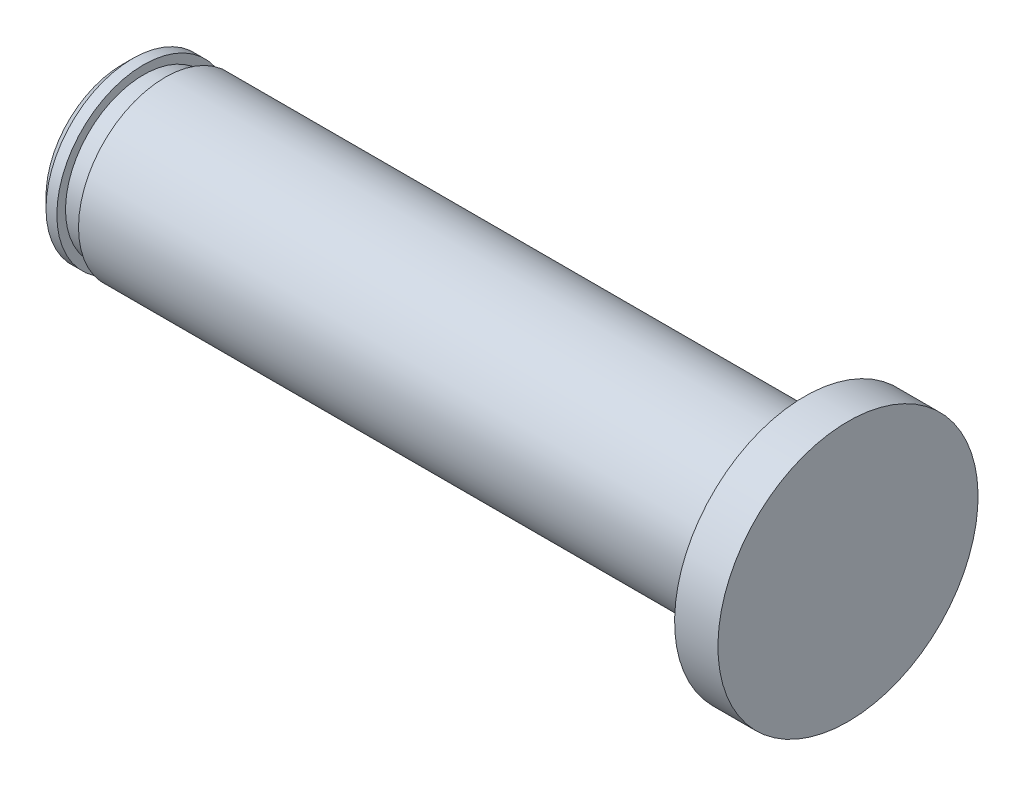
ISO-10303-21;
HEADER;
FILE_DESCRIPTION(('STEP AP214'),'2;1');
FILE_NAME('part.step','',(''),(''),'','','');
FILE_SCHEMA(('AUTOMOTIVE_DESIGN { 1 0 10303 214 1 1 1 1 }'));
ENDSEC;
DATA;
#1=APPLICATION_CONTEXT('core data for automotive mechanical design processes');
#2=APPLICATION_PROTOCOL_DEFINITION('international standard','automotive_design',2000,#1);
#3=PRODUCT_CONTEXT('',#1,'mechanical');
#4=PRODUCT('Part','Part','',(#3));
#5=PRODUCT_RELATED_PRODUCT_CATEGORY('part','',(#4));
#6=PRODUCT_DEFINITION_FORMATION('','',#4);
#7=PRODUCT_DEFINITION_CONTEXT('part definition',#1,'design');
#8=PRODUCT_DEFINITION('design','',#6,#7);
#9=PRODUCT_DEFINITION_SHAPE('','',#8);
#10=(LENGTH_UNIT() NAMED_UNIT(*) SI_UNIT(.MILLI.,.METRE.));
#11=(NAMED_UNIT(*) PLANE_ANGLE_UNIT() SI_UNIT($,.RADIAN.));
#12=(NAMED_UNIT(*) SI_UNIT($,.STERADIAN.) SOLID_ANGLE_UNIT());
#13=UNCERTAINTY_MEASURE_WITH_UNIT(LENGTH_MEASURE(1.E-05),#10,'distance_accuracy_value','');
#14=(GEOMETRIC_REPRESENTATION_CONTEXT(3) GLOBAL_UNCERTAINTY_ASSIGNED_CONTEXT((#13)) GLOBAL_UNIT_ASSIGNED_CONTEXT((#10,
#11,#12)) REPRESENTATION_CONTEXT('',''));
#15=CARTESIAN_POINT('',(0.,0.,0.));
#16=DIRECTION('',(0.,0.,1.));
#17=DIRECTION('',(1.,0.,0.));
#18=AXIS2_PLACEMENT_3D('',#15,#16,#17);
#19=CARTESIAN_POINT('',(0.,6.,0.));
#20=DIRECTION('',(-1.,0.,0.));
#21=DIRECTION('',(0.,-1.,0.));
#22=AXIS2_PLACEMENT_3D('',#19,#20,#21);
#23=PLANE('',#22);
#24=CARTESIAN_POINT('',(0.,0.,0.));
#25=DIRECTION('',(-1.,0.,0.));
#26=DIRECTION('',(0.,-1.,0.));
#27=AXIS2_PLACEMENT_3D('',#24,#25,#26);
#28=CIRCLE('',#27,6.);
#29=CARTESIAN_POINT('',(0.,-6.,0.));
#30=VERTEX_POINT('',#29);
#31=EDGE_CURVE('E67',#30,#30,#28,.T.);
#32=ORIENTED_EDGE('',*,*,#31,.F.);
#33=EDGE_LOOP('',(#32));
#34=FACE_BOUND('',#33,.T.);
#35=ADVANCED_FACE('F34',(#34),#23,.F.);
#36=CARTESIAN_POINT('',(-33.5000000000002,0.,0.));
#37=DIRECTION('',(1.,0.,0.));
#38=DIRECTION('',(0.,1.,0.));
#39=AXIS2_PLACEMENT_3D('',#36,#37,#38);
#40=PLANE('',#39);
#41=CARTESIAN_POINT('',(-33.5000000000002,0.,0.));
#42=DIRECTION('',(1.,0.,0.));
#43=DIRECTION('',(0.,1.,0.));
#44=AXIS2_PLACEMENT_3D('',#41,#42,#43);
#45=CIRCLE('',#44,3.5);
#46=CARTESIAN_POINT('',(-33.5000000000002,3.5,0.));
#47=VERTEX_POINT('',#46);
#48=EDGE_CURVE('E42',#47,#47,#45,.F.);
#49=ORIENTED_EDGE('',*,*,#48,.T.);
#50=EDGE_LOOP('',(#49));
#51=FACE_BOUND('',#50,.T.);
#52=ADVANCED_FACE('F74',(#51),#40,.F.);
#53=CARTESIAN_POINT('',(-33.5000000000002,0.,0.));
#54=DIRECTION('',(-1.,0.,0.));
#55=DIRECTION('',(0.,-1.,0.));
#56=AXIS2_PLACEMENT_3D('',#53,#54,#55);
#57=CYLINDRICAL_SURFACE('',#56,4.);
#58=CARTESIAN_POINT('',(-33.0000000000002,0.,0.));
#59=DIRECTION('',(1.,0.,0.));
#60=DIRECTION('',(0.,1.,0.));
#61=AXIS2_PLACEMENT_3D('',#58,#59,#60);
#62=CIRCLE('',#61,4.);
#63=CARTESIAN_POINT('',(-33.0000000000002,3.99999999999999,0.));
#64=VERTEX_POINT('',#63);
#65=EDGE_CURVE('E10',#64,#64,#62,.T.);
#66=ORIENTED_EDGE('',*,*,#65,.T.);
#67=EDGE_LOOP('',(#66));
#68=FACE_BOUND('',#67,.T.);
#69=CARTESIAN_POINT('',(-32.5000000000002,0.,0.));
#70=DIRECTION('',(-1.,0.,0.));
#71=DIRECTION('',(0.,-1.,0.));
#72=AXIS2_PLACEMENT_3D('',#69,#70,#71);
#73=CIRCLE('',#72,4.);
#74=CARTESIAN_POINT('',(-32.5000000000002,-4.,0.));
#75=VERTEX_POINT('',#74);
#76=EDGE_CURVE('E46',#75,#75,#73,.T.);
#77=ORIENTED_EDGE('',*,*,#76,.T.);
#78=EDGE_LOOP('',(#77));
#79=FACE_BOUND('',#78,.T.);
#80=ADVANCED_FACE('F78',(#68,#79),#57,.T.);
#81=CARTESIAN_POINT('',(-32.5000000000002,3.99999999999999,0.));
#82=DIRECTION('',(-1.,0.,0.));
#83=DIRECTION('',(0.,-1.,0.));
#84=AXIS2_PLACEMENT_3D('',#81,#82,#83);
#85=PLANE('',#84);
#86=ORIENTED_EDGE('',*,*,#76,.F.);
#87=EDGE_LOOP('',(#86));
#88=FACE_BOUND('',#87,.T.);
#89=CARTESIAN_POINT('',(-32.5000000000002,0.,0.));
#90=DIRECTION('',(-1.,0.,0.));
#91=DIRECTION('',(0.,-1.,0.));
#92=AXIS2_PLACEMENT_3D('',#89,#90,#91);
#93=CIRCLE('',#92,3.6);
#94=CARTESIAN_POINT('',(-32.5000000000002,-3.6,0.));
#95=VERTEX_POINT('',#94);
#96=EDGE_CURVE('E50',#95,#95,#93,.T.);
#97=ORIENTED_EDGE('',*,*,#96,.T.);
#98=EDGE_LOOP('',(#97));
#99=FACE_BOUND('',#98,.T.);
#100=ADVANCED_FACE('F83',(#88,#99),#85,.F.);
#101=CARTESIAN_POINT('',(-33.5000000000002,0.,0.));
#102=DIRECTION('',(-1.,0.,0.));
#103=DIRECTION('',(0.,-1.,0.));
#104=AXIS2_PLACEMENT_3D('',#101,#102,#103);
#105=CYLINDRICAL_SURFACE('',#104,3.6);
#106=ORIENTED_EDGE('',*,*,#96,.F.);
#107=EDGE_LOOP('',(#106));
#108=FACE_BOUND('',#107,.T.);
#109=CARTESIAN_POINT('',(-31.5000000000002,0.,0.));
#110=DIRECTION('',(-1.,0.,0.));
#111=DIRECTION('',(0.,-1.,0.));
#112=AXIS2_PLACEMENT_3D('',#109,#110,#111);
#113=CIRCLE('',#112,3.6);
#114=CARTESIAN_POINT('',(-31.5000000000002,-3.6,0.));
#115=VERTEX_POINT('',#114);
#116=EDGE_CURVE('E55',#115,#115,#113,.T.);
#117=ORIENTED_EDGE('',*,*,#116,.T.);
#118=EDGE_LOOP('',(#117));
#119=FACE_BOUND('',#118,.T.);
#120=ADVANCED_FACE('F86',(#108,#119),#105,.T.);
#121=CARTESIAN_POINT('',(-31.5000000000002,3.6,0.));
#122=DIRECTION('',(1.,0.,0.));
#123=DIRECTION('',(0.,1.,0.));
#124=AXIS2_PLACEMENT_3D('',#121,#122,#123);
#125=PLANE('',#124);
#126=ORIENTED_EDGE('',*,*,#116,.F.);
#127=EDGE_LOOP('',(#126));
#128=FACE_BOUND('',#127,.T.);
#129=CARTESIAN_POINT('',(-31.5000000000002,0.,0.));
#130=DIRECTION('',(-1.,0.,0.));
#131=DIRECTION('',(0.,-1.,0.));
#132=AXIS2_PLACEMENT_3D('',#129,#130,#131);
#133=CIRCLE('',#132,4.);
#134=CARTESIAN_POINT('',(-31.5000000000002,-4.,0.));
#135=VERTEX_POINT('',#134);
#136=EDGE_CURVE('E58',#135,#135,#133,.T.);
#137=ORIENTED_EDGE('',*,*,#136,.T.);
#138=EDGE_LOOP('',(#137));
#139=FACE_BOUND('',#138,.T.);
#140=ADVANCED_FACE('F90',(#128,#139),#125,.F.);
#141=CARTESIAN_POINT('',(-33.5000000000002,0.,0.));
#142=DIRECTION('',(-1.,0.,0.));
#143=DIRECTION('',(0.,-1.,0.));
#144=AXIS2_PLACEMENT_3D('',#141,#142,#143);
#145=CYLINDRICAL_SURFACE('',#144,3.99999999999999);
#146=ORIENTED_EDGE('',*,*,#136,.F.);
#147=EDGE_LOOP('',(#146));
#148=FACE_BOUND('',#147,.T.);
#149=CARTESIAN_POINT('',(-2.,0.,0.));
#150=DIRECTION('',(-1.,0.,0.));
#151=DIRECTION('',(0.,-1.,0.));
#152=AXIS2_PLACEMENT_3D('',#149,#150,#151);
#153=CIRCLE('',#152,3.99999999999999);
#154=CARTESIAN_POINT('',(-2.,-3.99999999999999,0.));
#155=VERTEX_POINT('',#154);
#156=EDGE_CURVE('E61',#155,#155,#153,.T.);
#157=ORIENTED_EDGE('',*,*,#156,.T.);
#158=EDGE_LOOP('',(#157));
#159=FACE_BOUND('',#158,.T.);
#160=ADVANCED_FACE('F94',(#148,#159),#145,.T.);
#161=CARTESIAN_POINT('',(-2.,3.99999999999999,0.));
#162=DIRECTION('',(1.,0.,0.));
#163=DIRECTION('',(0.,1.,0.));
#164=AXIS2_PLACEMENT_3D('',#161,#162,#163);
#165=PLANE('',#164);
#166=ORIENTED_EDGE('',*,*,#156,.F.);
#167=EDGE_LOOP('',(#166));
#168=FACE_BOUND('',#167,.T.);
#169=CARTESIAN_POINT('',(-2.,0.,0.));
#170=DIRECTION('',(-1.,0.,0.));
#171=DIRECTION('',(0.,-1.,0.));
#172=AXIS2_PLACEMENT_3D('',#169,#170,#171);
#173=CIRCLE('',#172,6.);
#174=CARTESIAN_POINT('',(-2.,-6.,0.));
#175=VERTEX_POINT('',#174);
#176=EDGE_CURVE('E64',#175,#175,#173,.T.);
#177=ORIENTED_EDGE('',*,*,#176,.T.);
#178=EDGE_LOOP('',(#177));
#179=FACE_BOUND('',#178,.T.);
#180=ADVANCED_FACE('F98',(#168,#179),#165,.F.);
#181=CARTESIAN_POINT('',(-33.5000000000002,0.,0.));
#182=DIRECTION('',(-1.,0.,0.));
#183=DIRECTION('',(0.,-1.,0.));
#184=AXIS2_PLACEMENT_3D('',#181,#182,#183);
#185=CYLINDRICAL_SURFACE('',#184,6.);
#186=ORIENTED_EDGE('',*,*,#176,.F.);
#187=EDGE_LOOP('',(#186));
#188=FACE_BOUND('',#187,.T.);
#189=ORIENTED_EDGE('',*,*,#31,.T.);
#190=EDGE_LOOP('',(#189));
#191=FACE_BOUND('',#190,.T.);
#192=ADVANCED_FACE('F71',(#188,#191),#185,.T.);
#193=CARTESIAN_POINT('',(-33.5000000000002,0.,0.));
#194=DIRECTION('',(1.,0.,0.));
#195=DIRECTION('',(0.,1.,0.));
#196=AXIS2_PLACEMENT_3D('',#193,#194,#195);
#197=CONICAL_SURFACE('',#196,3.5,0.785398163397445);
#198=ORIENTED_EDGE('',*,*,#65,.F.);
#199=EDGE_LOOP('',(#198));
#200=FACE_BOUND('',#199,.T.);
#201=ORIENTED_EDGE('',*,*,#48,.F.);
#202=EDGE_LOOP('',(#201));
#203=FACE_BOUND('',#202,.T.);
#204=ADVANCED_FACE('F37',(#200,#203),#197,.T.);
#205=CLOSED_SHELL('',(#35,#52,#80,#100,#120,#140,#160,#180,#192,#204));
#206=MANIFOLD_SOLID_BREP('B2',#205);
#207=ADVANCED_BREP_SHAPE_REPRESENTATION('',(#18,#206),#14);
#208=SHAPE_DEFINITION_REPRESENTATION(#9,#207);
ENDSEC;
END-ISO-10303-21;
